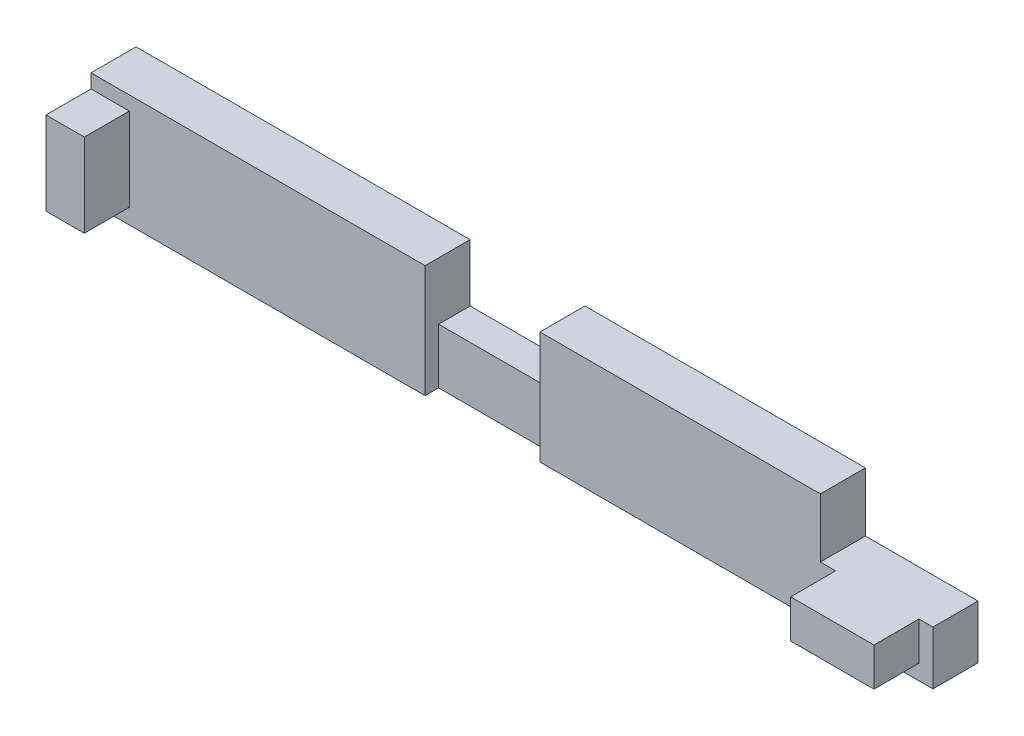
ISO-10303-21;
HEADER;
FILE_DESCRIPTION(('STEP AP214'),'2;1');
FILE_NAME('part.step','',(''),(''),'','','');
FILE_SCHEMA(('AUTOMOTIVE_DESIGN { 1 0 10303 214 1 1 1 1 }'));
ENDSEC;
DATA;
#1=APPLICATION_CONTEXT('core data for automotive mechanical design processes');
#2=APPLICATION_PROTOCOL_DEFINITION('international standard','automotive_design',2000,#1);
#3=PRODUCT_CONTEXT('',#1,'mechanical');
#4=PRODUCT('Part','Part','',(#3));
#5=PRODUCT_RELATED_PRODUCT_CATEGORY('part','',(#4));
#6=PRODUCT_DEFINITION_FORMATION('','',#4);
#7=PRODUCT_DEFINITION_CONTEXT('part definition',#1,'design');
#8=PRODUCT_DEFINITION('design','',#6,#7);
#9=PRODUCT_DEFINITION_SHAPE('','',#8);
#10=(LENGTH_UNIT() NAMED_UNIT(*) SI_UNIT(.MILLI.,.METRE.));
#11=(NAMED_UNIT(*) PLANE_ANGLE_UNIT() SI_UNIT($,.RADIAN.));
#12=(NAMED_UNIT(*) SI_UNIT($,.STERADIAN.) SOLID_ANGLE_UNIT());
#13=UNCERTAINTY_MEASURE_WITH_UNIT(LENGTH_MEASURE(1.E-05),#10,'distance_accuracy_value','');
#14=(GEOMETRIC_REPRESENTATION_CONTEXT(3) GLOBAL_UNCERTAINTY_ASSIGNED_CONTEXT((#13)) GLOBAL_UNIT_ASSIGNED_CONTEXT((#10,
#11,#12)) REPRESENTATION_CONTEXT('',''));
#15=CARTESIAN_POINT('',(0.,0.,0.));
#16=DIRECTION('',(0.,0.,1.));
#17=DIRECTION('',(1.,0.,0.));
#18=AXIS2_PLACEMENT_3D('',#15,#16,#17);
#19=CARTESIAN_POINT('',(0.,0.,10.));
#20=DIRECTION('',(0.,0.,-1.));
#21=DIRECTION('',(-1.,0.,0.));
#22=AXIS2_PLACEMENT_3D('',#19,#20,#21);
#23=PLANE('',#22);
#24=DIRECTION('',(1.,0.,0.));
#25=VECTOR('',#24,1.);
#26=CARTESIAN_POINT('',(0.,0.,10.));
#27=LINE('',#26,#25);
#28=CARTESIAN_POINT('',(13.1,0.,10.));
#29=VERTEX_POINT('',#28);
#30=CARTESIAN_POINT('',(87.25,0.,10.));
#31=VERTEX_POINT('',#30);
#32=EDGE_CURVE('E213',#29,#31,#27,.T.);
#33=ORIENTED_EDGE('',*,*,#32,.T.);
#34=DIRECTION('',(0.,-1.,0.));
#35=VECTOR('',#34,1.);
#36=CARTESIAN_POINT('',(87.25,37.75,10.));
#37=LINE('',#36,#35);
#38=CARTESIAN_POINT('',(87.25,25.,10.));
#39=VERTEX_POINT('',#38);
#40=EDGE_CURVE('E207',#39,#31,#37,.T.);
#41=ORIENTED_EDGE('',*,*,#40,.F.);
#42=DIRECTION('',(-1.,0.,0.));
#43=VECTOR('',#42,1.);
#44=CARTESIAN_POINT('',(0.,25.,10.));
#45=LINE('',#44,#43);
#46=CARTESIAN_POINT('',(13.1,25.,10.));
#47=VERTEX_POINT('',#46);
#48=EDGE_CURVE('E220',#39,#47,#45,.T.);
#49=ORIENTED_EDGE('',*,*,#48,.T.);
#50=DIRECTION('',(0.,-1.,0.));
#51=VECTOR('',#50,1.);
#52=CARTESIAN_POINT('',(13.1,0.,10.));
#53=LINE('',#52,#51);
#54=CARTESIAN_POINT('',(13.1,21.9,10.));
#55=VERTEX_POINT('',#54);
#56=EDGE_CURVE('E338',#47,#55,#53,.T.);
#57=ORIENTED_EDGE('',*,*,#56,.T.);
#58=DIRECTION('',(1.,0.,0.));
#59=VECTOR('',#58,1.);
#60=CARTESIAN_POINT('',(0.,21.9,10.));
#61=LINE('',#60,#59);
#62=CARTESIAN_POINT('',(21.6,21.9,10.));
#63=VERTEX_POINT('',#62);
#64=EDGE_CURVE('E279',#55,#63,#61,.T.);
#65=ORIENTED_EDGE('',*,*,#64,.T.);
#66=DIRECTION('',(0.,-1.,0.));
#67=VECTOR('',#66,1.);
#68=CARTESIAN_POINT('',(21.6,0.,10.));
#69=LINE('',#68,#67);
#70=CARTESIAN_POINT('',(21.6,3.40000000000001,10.));
#71=VERTEX_POINT('',#70);
#72=EDGE_CURVE('E271',#63,#71,#69,.T.);
#73=ORIENTED_EDGE('',*,*,#72,.T.);
#74=DIRECTION('',(1.,0.,0.));
#75=VECTOR('',#74,1.);
#76=CARTESIAN_POINT('',(0.,3.40000000000001,10.));
#77=LINE('',#76,#75);
#78=CARTESIAN_POINT('',(13.1,3.40000000000001,10.));
#79=VERTEX_POINT('',#78);
#80=EDGE_CURVE('E50',#79,#71,#77,.T.);
#81=ORIENTED_EDGE('',*,*,#80,.F.);
#82=EDGE_CURVE('E265',#79,#29,#53,.T.);
#83=ORIENTED_EDGE('',*,*,#82,.T.);
#84=EDGE_LOOP('',(#33,#41,#49,#57,#65,#73,#81,#83));
#85=FACE_BOUND('',#84,.T.);
#86=ADVANCED_FACE('F35',(#85),#23,.F.);
#87=CARTESIAN_POINT('',(0.,0.,10.));
#88=DIRECTION('',(0.,1.,0.));
#89=DIRECTION('',(0.,0.,1.));
#90=AXIS2_PLACEMENT_3D('',#87,#88,#89);
#91=PLANE('',#90);
#92=DIRECTION('',(-1.,0.,0.));
#93=VECTOR('',#92,1.);
#94=CARTESIAN_POINT('',(0.,0.,7.));
#95=LINE('',#94,#93);
#96=CARTESIAN_POINT('',(112.75,0.,7.));
#97=VERTEX_POINT('',#96);
#98=CARTESIAN_POINT('',(87.25,0.,7.));
#99=VERTEX_POINT('',#98);
#100=EDGE_CURVE('E180',#97,#99,#95,.T.);
#101=ORIENTED_EDGE('',*,*,#100,.T.);
#102=DIRECTION('',(0.,0.,1.));
#103=VECTOR('',#102,1.);
#104=CARTESIAN_POINT('',(87.25,0.,10.));
#105=LINE('',#104,#103);
#106=EDGE_CURVE('E261',#99,#31,#105,.T.);
#107=ORIENTED_EDGE('',*,*,#106,.T.);
#108=ORIENTED_EDGE('',*,*,#32,.F.);
#109=DIRECTION('',(0.,0.,1.));
#110=VECTOR('',#109,1.);
#111=CARTESIAN_POINT('',(13.1,0.,0.));
#112=LINE('',#111,#110);
#113=CARTESIAN_POINT('',(13.1,0.,0.));
#114=VERTEX_POINT('',#113);
#115=EDGE_CURVE('E282',#114,#29,#112,.T.);
#116=ORIENTED_EDGE('',*,*,#115,.F.);
#117=DIRECTION('',(1.,0.,0.));
#118=VECTOR('',#117,1.);
#119=CARTESIAN_POINT('',(0.,0.,0.));
#120=LINE('',#119,#118);
#121=CARTESIAN_POINT('',(200.,0.,0.));
#122=VERTEX_POINT('',#121);
#123=EDGE_CURVE('E212',#114,#122,#120,.T.);
#124=ORIENTED_EDGE('',*,*,#123,.T.);
#125=DIRECTION('',(0.,0.,-1.));
#126=VECTOR('',#125,1.);
#127=CARTESIAN_POINT('',(200.,0.,10.));
#128=LINE('',#127,#126);
#129=CARTESIAN_POINT('',(200.,0.,10.));
#130=VERTEX_POINT('',#129);
#131=EDGE_CURVE('E43',#130,#122,#128,.T.);
#132=ORIENTED_EDGE('',*,*,#131,.F.);
#133=CARTESIAN_POINT('',(112.75,0.,10.));
#134=VERTEX_POINT('',#133);
#135=EDGE_CURVE('E217',#134,#130,#27,.T.);
#136=ORIENTED_EDGE('',*,*,#135,.F.);
#137=DIRECTION('',(0.,0.,-1.));
#138=VECTOR('',#137,1.);
#139=CARTESIAN_POINT('',(112.75,0.,10.));
#140=LINE('',#139,#138);
#141=EDGE_CURVE('E392',#134,#97,#140,.T.);
#142=ORIENTED_EDGE('',*,*,#141,.T.);
#143=EDGE_LOOP('',(#101,#107,#108,#116,#124,#132,#136,#142));
#144=FACE_BOUND('',#143,.T.);
#145=ADVANCED_FACE('F37',(#144),#91,.F.);
#146=CARTESIAN_POINT('',(200.,0.,10.));
#147=DIRECTION('',(-1.,0.,0.));
#148=DIRECTION('',(0.,0.,1.));
#149=AXIS2_PLACEMENT_3D('',#146,#147,#148);
#150=PLANE('',#149);
#151=DIRECTION('',(0.,0.,1.));
#152=VECTOR('',#151,1.);
#153=CARTESIAN_POINT('',(200.,11.9,0.));
#154=LINE('',#153,#152);
#155=CARTESIAN_POINT('',(200.,11.9,0.));
#156=VERTEX_POINT('',#155);
#157=CARTESIAN_POINT('',(200.,11.9,10.));
#158=VERTEX_POINT('',#157);
#159=EDGE_CURVE('E263',#156,#158,#154,.T.);
#160=ORIENTED_EDGE('',*,*,#159,.T.);
#161=DIRECTION('',(0.,1.,0.));
#162=VECTOR('',#161,1.);
#163=CARTESIAN_POINT('',(200.,0.,10.));
#164=LINE('',#163,#162);
#165=EDGE_CURVE('E216',#130,#158,#164,.T.);
#166=ORIENTED_EDGE('',*,*,#165,.F.);
#167=ORIENTED_EDGE('',*,*,#131,.T.);
#168=DIRECTION('',(0.,1.,0.));
#169=VECTOR('',#168,1.);
#170=CARTESIAN_POINT('',(200.,0.,0.));
#171=LINE('',#170,#169);
#172=EDGE_CURVE('E224',#122,#156,#171,.T.);
#173=ORIENTED_EDGE('',*,*,#172,.T.);
#174=EDGE_LOOP('',(#160,#166,#167,#173));
#175=FACE_BOUND('',#174,.T.);
#176=ADVANCED_FACE('F235',(#175),#150,.F.);
#177=CARTESIAN_POINT('',(0.,25.,10.));
#178=DIRECTION('',(0.,-1.,0.));
#179=DIRECTION('',(0.,0.,-1.));
#180=AXIS2_PLACEMENT_3D('',#177,#178,#179);
#181=PLANE('',#180);
#182=DIRECTION('',(0.,0.,1.));
#183=VECTOR('',#182,1.);
#184=CARTESIAN_POINT('',(13.1,25.,0.));
#185=LINE('',#184,#183);
#186=CARTESIAN_POINT('',(13.1,25.,0.));
#187=VERTEX_POINT('',#186);
#188=EDGE_CURVE('E343',#187,#47,#185,.T.);
#189=ORIENTED_EDGE('',*,*,#188,.T.);
#190=ORIENTED_EDGE('',*,*,#48,.F.);
#191=DIRECTION('',(0.,0.,-1.));
#192=VECTOR('',#191,1.);
#193=CARTESIAN_POINT('',(87.25,25.,10.));
#194=LINE('',#193,#192);
#195=CARTESIAN_POINT('',(87.25,25.,0.));
#196=VERTEX_POINT('',#195);
#197=EDGE_CURVE('E199',#39,#196,#194,.T.);
#198=ORIENTED_EDGE('',*,*,#197,.T.);
#199=DIRECTION('',(-1.,0.,0.));
#200=VECTOR('',#199,1.);
#201=CARTESIAN_POINT('',(0.,25.,0.));
#202=LINE('',#201,#200);
#203=EDGE_CURVE('E227',#196,#187,#202,.T.);
#204=ORIENTED_EDGE('',*,*,#203,.T.);
#205=EDGE_LOOP('',(#189,#190,#198,#204));
#206=FACE_BOUND('',#205,.T.);
#207=ADVANCED_FACE('F350',(#206),#181,.F.);
#208=DIRECTION('',(0.,1.,0.));
#209=VECTOR('',#208,1.);
#210=CARTESIAN_POINT('',(112.75,37.75,10.));
#211=LINE('',#210,#209);
#212=CARTESIAN_POINT('',(112.75,25.,10.));
#213=VERTEX_POINT('',#212);
#214=EDGE_CURVE('E322',#134,#213,#211,.T.);
#215=ORIENTED_EDGE('',*,*,#214,.F.);
#216=ORIENTED_EDGE('',*,*,#135,.T.);
#217=ORIENTED_EDGE('',*,*,#165,.T.);
#218=DIRECTION('',(-1.,0.,0.));
#219=VECTOR('',#218,1.);
#220=CARTESIAN_POINT('',(0.,11.9,10.));
#221=LINE('',#220,#219);
#222=CARTESIAN_POINT('',(196.9,11.9,10.));
#223=VERTEX_POINT('',#222);
#224=EDGE_CURVE('E253',#158,#223,#221,.T.);
#225=ORIENTED_EDGE('',*,*,#224,.T.);
#226=DIRECTION('',(0.,-1.,0.));
#227=VECTOR('',#226,1.);
#228=CARTESIAN_POINT('',(196.9,0.,10.));
#229=LINE('',#228,#227);
#230=CARTESIAN_POINT('',(196.9,3.4,10.));
#231=VERTEX_POINT('',#230);
#232=EDGE_CURVE('E299',#223,#231,#229,.T.);
#233=ORIENTED_EDGE('',*,*,#232,.T.);
#234=DIRECTION('',(-1.,0.,0.));
#235=VECTOR('',#234,1.);
#236=CARTESIAN_POINT('',(0.,3.39999999999997,10.));
#237=LINE('',#236,#235);
#238=CARTESIAN_POINT('',(178.4,3.4,10.));
#239=VERTEX_POINT('',#238);
#240=EDGE_CURVE('E58',#231,#239,#237,.T.);
#241=ORIENTED_EDGE('',*,*,#240,.T.);
#242=DIRECTION('',(0.,-1.,0.));
#243=VECTOR('',#242,1.);
#244=CARTESIAN_POINT('',(178.4,0.,10.));
#245=LINE('',#244,#243);
#246=CARTESIAN_POINT('',(178.4,11.9,10.));
#247=VERTEX_POINT('',#246);
#248=EDGE_CURVE('E294',#247,#239,#245,.T.);
#249=ORIENTED_EDGE('',*,*,#248,.F.);
#250=CARTESIAN_POINT('',(175.,11.9,10.));
#251=VERTEX_POINT('',#250);
#252=EDGE_CURVE('E260',#247,#251,#221,.T.);
#253=ORIENTED_EDGE('',*,*,#252,.T.);
#254=DIRECTION('',(0.,-1.,0.));
#255=VECTOR('',#254,1.);
#256=CARTESIAN_POINT('',(175.,0.,10.));
#257=LINE('',#256,#255);
#258=CARTESIAN_POINT('',(175.,25.,10.));
#259=VERTEX_POINT('',#258);
#260=EDGE_CURVE('E257',#259,#251,#257,.T.);
#261=ORIENTED_EDGE('',*,*,#260,.F.);
#262=EDGE_CURVE('E221',#259,#213,#45,.T.);
#263=ORIENTED_EDGE('',*,*,#262,.T.);
#264=EDGE_LOOP('',(#215,#216,#217,#225,#233,#241,#249,#253,#261,#263));
#265=FACE_BOUND('',#264,.T.);
#266=ADVANCED_FACE('F376',(#265),#23,.F.);
#267=CARTESIAN_POINT('',(0.,0.,0.));
#268=DIRECTION('',(0.,0.,-1.));
#269=DIRECTION('',(-1.,0.,0.));
#270=AXIS2_PLACEMENT_3D('',#267,#268,#269);
#271=PLANE('',#270);
#272=ORIENTED_EDGE('',*,*,#123,.F.);
#273=DIRECTION('',(0.,-1.,0.));
#274=VECTOR('',#273,1.);
#275=CARTESIAN_POINT('',(13.1,0.,0.));
#276=LINE('',#275,#274);
#277=EDGE_CURVE('E340',#187,#114,#276,.T.);
#278=ORIENTED_EDGE('',*,*,#277,.F.);
#279=ORIENTED_EDGE('',*,*,#203,.F.);
#280=DIRECTION('',(0.,1.,0.));
#281=VECTOR('',#280,1.);
#282=CARTESIAN_POINT('',(87.25,0.,0.));
#283=LINE('',#282,#281);
#284=CARTESIAN_POINT('',(87.25,12.25,0.));
#285=VERTEX_POINT('',#284);
#286=EDGE_CURVE('E11',#285,#196,#283,.T.);
#287=ORIENTED_EDGE('',*,*,#286,.F.);
#288=DIRECTION('',(1.,0.,0.));
#289=VECTOR('',#288,1.);
#290=CARTESIAN_POINT('',(87.25,12.25,0.));
#291=LINE('',#290,#289);
#292=CARTESIAN_POINT('',(112.75,12.25,0.));
#293=VERTEX_POINT('',#292);
#294=EDGE_CURVE('E204',#285,#293,#291,.T.);
#295=ORIENTED_EDGE('',*,*,#294,.T.);
#296=DIRECTION('',(0.,1.,0.));
#297=VECTOR('',#296,1.);
#298=CARTESIAN_POINT('',(112.75,37.75,0.));
#299=LINE('',#298,#297);
#300=CARTESIAN_POINT('',(112.75,25.,0.));
#301=VERTEX_POINT('',#300);
#302=EDGE_CURVE('E197',#293,#301,#299,.T.);
#303=ORIENTED_EDGE('',*,*,#302,.T.);
#304=CARTESIAN_POINT('',(175.,25.,0.));
#305=VERTEX_POINT('',#304);
#306=EDGE_CURVE('E228',#305,#301,#202,.T.);
#307=ORIENTED_EDGE('',*,*,#306,.F.);
#308=DIRECTION('',(0.,-1.,0.));
#309=VECTOR('',#308,1.);
#310=CARTESIAN_POINT('',(175.,0.,0.));
#311=LINE('',#310,#309);
#312=CARTESIAN_POINT('',(175.,11.9,0.));
#313=VERTEX_POINT('',#312);
#314=EDGE_CURVE('E246',#305,#313,#311,.T.);
#315=ORIENTED_EDGE('',*,*,#314,.T.);
#316=DIRECTION('',(-1.,0.,0.));
#317=VECTOR('',#316,1.);
#318=CARTESIAN_POINT('',(0.,11.9,0.));
#319=LINE('',#318,#317);
#320=EDGE_CURVE('E244',#156,#313,#319,.T.);
#321=ORIENTED_EDGE('',*,*,#320,.F.);
#322=ORIENTED_EDGE('',*,*,#172,.F.);
#323=EDGE_LOOP('',(#272,#278,#279,#287,#295,#303,#307,#315,#321,#322));
#324=FACE_BOUND('',#323,.T.);
#325=ADVANCED_FACE('F241',(#324),#271,.T.);
#326=ORIENTED_EDGE('',*,*,#262,.F.);
#327=DIRECTION('',(0.,0.,1.));
#328=VECTOR('',#327,1.);
#329=CARTESIAN_POINT('',(175.,25.,0.));
#330=LINE('',#329,#328);
#331=EDGE_CURVE('E249',#305,#259,#330,.T.);
#332=ORIENTED_EDGE('',*,*,#331,.F.);
#333=ORIENTED_EDGE('',*,*,#306,.T.);
#334=DIRECTION('',(0.,0.,1.));
#335=VECTOR('',#334,1.);
#336=CARTESIAN_POINT('',(112.75,25.,10.));
#337=LINE('',#336,#335);
#338=EDGE_CURVE('E202',#301,#213,#337,.T.);
#339=ORIENTED_EDGE('',*,*,#338,.T.);
#340=EDGE_LOOP('',(#326,#332,#333,#339));
#341=FACE_BOUND('',#340,.T.);
#342=ADVANCED_FACE('F388',(#341),#181,.F.);
#343=CARTESIAN_POINT('',(112.75,37.75,0.));
#344=DIRECTION('',(1.,0.,0.));
#345=DIRECTION('',(0.,0.,-1.));
#346=AXIS2_PLACEMENT_3D('',#343,#344,#345);
#347=PLANE('',#346);
#348=ORIENTED_EDGE('',*,*,#302,.F.);
#349=DIRECTION('',(0.,0.,1.));
#350=VECTOR('',#349,1.);
#351=CARTESIAN_POINT('',(112.75,12.25,0.));
#352=LINE('',#351,#350);
#353=CARTESIAN_POINT('',(112.75,12.25,7.));
#354=VERTEX_POINT('',#353);
#355=EDGE_CURVE('E189',#293,#354,#352,.T.);
#356=ORIENTED_EDGE('',*,*,#355,.T.);
#357=DIRECTION('',(0.,1.,0.));
#358=VECTOR('',#357,1.);
#359=CARTESIAN_POINT('',(112.75,-0.750000000000001,7.));
#360=LINE('',#359,#358);
#361=EDGE_CURVE('E173',#97,#354,#360,.T.);
#362=ORIENTED_EDGE('',*,*,#361,.F.);
#363=ORIENTED_EDGE('',*,*,#141,.F.);
#364=ORIENTED_EDGE('',*,*,#214,.T.);
#365=ORIENTED_EDGE('',*,*,#338,.F.);
#366=EDGE_LOOP('',(#348,#356,#362,#363,#364,#365));
#367=FACE_BOUND('',#366,.T.);
#368=ADVANCED_FACE('F194',(#367),#347,.F.);
#369=CARTESIAN_POINT('',(87.25,37.75,0.));
#370=DIRECTION('',(-1.,0.,0.));
#371=DIRECTION('',(0.,-1.,0.));
#372=AXIS2_PLACEMENT_3D('',#369,#370,#371);
#373=PLANE('',#372);
#374=ORIENTED_EDGE('',*,*,#40,.T.);
#375=ORIENTED_EDGE('',*,*,#106,.F.);
#376=DIRECTION('',(0.,1.,0.));
#377=VECTOR('',#376,1.);
#378=CARTESIAN_POINT('',(87.25,-0.750000000000001,7.));
#379=LINE('',#378,#377);
#380=CARTESIAN_POINT('',(87.25,12.25,7.));
#381=VERTEX_POINT('',#380);
#382=EDGE_CURVE('E185',#99,#381,#379,.T.);
#383=ORIENTED_EDGE('',*,*,#382,.T.);
#384=DIRECTION('',(0.,0.,1.));
#385=VECTOR('',#384,1.);
#386=CARTESIAN_POINT('',(87.25,12.25,0.));
#387=LINE('',#386,#385);
#388=EDGE_CURVE('E192',#285,#381,#387,.T.);
#389=ORIENTED_EDGE('',*,*,#388,.F.);
#390=ORIENTED_EDGE('',*,*,#286,.T.);
#391=ORIENTED_EDGE('',*,*,#197,.F.);
#392=EDGE_LOOP('',(#374,#375,#383,#389,#390,#391));
#393=FACE_BOUND('',#392,.T.);
#394=ADVANCED_FACE('F328',(#393),#373,.F.);
#395=CARTESIAN_POINT('',(87.25,12.25,0.));
#396=DIRECTION('',(0.,-1.,0.));
#397=DIRECTION('',(0.,0.,-1.));
#398=AXIS2_PLACEMENT_3D('',#395,#396,#397);
#399=PLANE('',#398);
#400=ORIENTED_EDGE('',*,*,#388,.T.);
#401=DIRECTION('',(-1.,0.,0.));
#402=VECTOR('',#401,1.);
#403=CARTESIAN_POINT('',(87.25,12.25,7.));
#404=LINE('',#403,#402);
#405=EDGE_CURVE('E177',#354,#381,#404,.T.);
#406=ORIENTED_EDGE('',*,*,#405,.F.);
#407=ORIENTED_EDGE('',*,*,#355,.F.);
#408=ORIENTED_EDGE('',*,*,#294,.F.);
#409=EDGE_LOOP('',(#400,#406,#407,#408));
#410=FACE_BOUND('',#409,.T.);
#411=ADVANCED_FACE('F188',(#410),#399,.F.);
#412=CARTESIAN_POINT('',(0.,11.9,20.));
#413=DIRECTION('',(0.,1.,0.));
#414=DIRECTION('',(0.,0.,1.));
#415=AXIS2_PLACEMENT_3D('',#412,#413,#414);
#416=PLANE('',#415);
#417=DIRECTION('',(0.,0.,-1.));
#418=VECTOR('',#417,1.);
#419=CARTESIAN_POINT('',(196.9,11.9,20.));
#420=LINE('',#419,#418);
#421=CARTESIAN_POINT('',(196.9,11.9,20.));
#422=VERTEX_POINT('',#421);
#423=EDGE_CURVE('E307',#422,#223,#420,.T.);
#424=ORIENTED_EDGE('',*,*,#423,.T.);
#425=ORIENTED_EDGE('',*,*,#224,.F.);
#426=ORIENTED_EDGE('',*,*,#159,.F.);
#427=ORIENTED_EDGE('',*,*,#320,.T.);
#428=DIRECTION('',(0.,0.,1.));
#429=VECTOR('',#428,1.);
#430=CARTESIAN_POINT('',(175.,11.9,0.));
#431=LINE('',#430,#429);
#432=EDGE_CURVE('E251',#313,#251,#431,.T.);
#433=ORIENTED_EDGE('',*,*,#432,.T.);
#434=ORIENTED_EDGE('',*,*,#252,.F.);
#435=DIRECTION('',(0.,0.,-1.));
#436=VECTOR('',#435,1.);
#437=CARTESIAN_POINT('',(178.4,11.9,20.));
#438=LINE('',#437,#436);
#439=CARTESIAN_POINT('',(178.4,11.9,20.));
#440=VERTEX_POINT('',#439);
#441=EDGE_CURVE('E319',#440,#247,#438,.T.);
#442=ORIENTED_EDGE('',*,*,#441,.F.);
#443=DIRECTION('',(1.,0.,0.));
#444=VECTOR('',#443,1.);
#445=CARTESIAN_POINT('',(0.,11.9,20.));
#446=LINE('',#445,#444);
#447=EDGE_CURVE('E295',#440,#422,#446,.T.);
#448=ORIENTED_EDGE('',*,*,#447,.T.);
#449=EDGE_LOOP('',(#424,#425,#426,#427,#433,#434,#442,#448));
#450=FACE_BOUND('',#449,.T.);
#451=ADVANCED_FACE('F400',(#450),#416,.T.);
#452=CARTESIAN_POINT('',(178.4,0.,20.));
#453=DIRECTION('',(1.,0.,0.));
#454=DIRECTION('',(0.,0.,-1.));
#455=AXIS2_PLACEMENT_3D('',#452,#453,#454);
#456=PLANE('',#455);
#457=ORIENTED_EDGE('',*,*,#248,.T.);
#458=DIRECTION('',(0.,0.,-1.));
#459=VECTOR('',#458,1.);
#460=CARTESIAN_POINT('',(178.4,3.4,20.));
#461=LINE('',#460,#459);
#462=CARTESIAN_POINT('',(178.4,3.4,20.));
#463=VERTEX_POINT('',#462);
#464=EDGE_CURVE('E317',#463,#239,#461,.T.);
#465=ORIENTED_EDGE('',*,*,#464,.F.);
#466=DIRECTION('',(0.,-1.,0.));
#467=VECTOR('',#466,1.);
#468=CARTESIAN_POINT('',(178.4,0.,20.));
#469=LINE('',#468,#467);
#470=EDGE_CURVE('E298',#440,#463,#469,.T.);
#471=ORIENTED_EDGE('',*,*,#470,.F.);
#472=ORIENTED_EDGE('',*,*,#441,.T.);
#473=EDGE_LOOP('',(#457,#465,#471,#472));
#474=FACE_BOUND('',#473,.T.);
#475=ADVANCED_FACE('F403',(#474),#456,.F.);
#476=CARTESIAN_POINT('',(0.,3.39999999999997,20.));
#477=DIRECTION('',(0.,-1.,0.));
#478=DIRECTION('',(1.,0.,0.));
#479=AXIS2_PLACEMENT_3D('',#476,#477,#478);
#480=PLANE('',#479);
#481=ORIENTED_EDGE('',*,*,#240,.F.);
#482=DIRECTION('',(0.,0.,-1.));
#483=VECTOR('',#482,1.);
#484=CARTESIAN_POINT('',(196.9,3.4,20.));
#485=LINE('',#484,#483);
#486=CARTESIAN_POINT('',(196.9,3.4,20.));
#487=VERTEX_POINT('',#486);
#488=EDGE_CURVE('E315',#487,#231,#485,.T.);
#489=ORIENTED_EDGE('',*,*,#488,.F.);
#490=DIRECTION('',(-1.,0.,0.));
#491=VECTOR('',#490,1.);
#492=CARTESIAN_POINT('',(0.,3.39999999999997,20.));
#493=LINE('',#492,#491);
#494=EDGE_CURVE('E301',#487,#463,#493,.T.);
#495=ORIENTED_EDGE('',*,*,#494,.T.);
#496=ORIENTED_EDGE('',*,*,#464,.T.);
#497=EDGE_LOOP('',(#481,#489,#495,#496));
#498=FACE_BOUND('',#497,.T.);
#499=ADVANCED_FACE('F413',(#498),#480,.T.);
#500=CARTESIAN_POINT('',(196.9,0.,20.));
#501=DIRECTION('',(1.,0.,0.));
#502=DIRECTION('',(0.,0.,-1.));
#503=AXIS2_PLACEMENT_3D('',#500,#501,#502);
#504=PLANE('',#503);
#505=ORIENTED_EDGE('',*,*,#232,.F.);
#506=ORIENTED_EDGE('',*,*,#423,.F.);
#507=DIRECTION('',(0.,-1.,0.));
#508=VECTOR('',#507,1.);
#509=CARTESIAN_POINT('',(196.9,0.,20.));
#510=LINE('',#509,#508);
#511=EDGE_CURVE('E304',#422,#487,#510,.T.);
#512=ORIENTED_EDGE('',*,*,#511,.T.);
#513=ORIENTED_EDGE('',*,*,#488,.T.);
#514=EDGE_LOOP('',(#505,#506,#512,#513));
#515=FACE_BOUND('',#514,.T.);
#516=ADVANCED_FACE('F412',(#515),#504,.T.);
#517=CARTESIAN_POINT('',(0.,0.,20.));
#518=DIRECTION('',(0.,0.,1.));
#519=DIRECTION('',(1.,0.,0.));
#520=AXIS2_PLACEMENT_3D('',#517,#518,#519);
#521=PLANE('',#520);
#522=ORIENTED_EDGE('',*,*,#447,.F.);
#523=ORIENTED_EDGE('',*,*,#470,.T.);
#524=ORIENTED_EDGE('',*,*,#494,.F.);
#525=ORIENTED_EDGE('',*,*,#511,.F.);
#526=EDGE_LOOP('',(#522,#523,#524,#525));
#527=FACE_BOUND('',#526,.T.);
#528=ADVANCED_FACE('F409',(#527),#521,.T.);
#529=CARTESIAN_POINT('',(0.,21.9,20.));
#530=DIRECTION('',(0.,1.,0.));
#531=DIRECTION('',(-1.,0.,0.));
#532=AXIS2_PLACEMENT_3D('',#529,#530,#531);
#533=PLANE('',#532);
#534=ORIENTED_EDGE('',*,*,#64,.F.);
#535=DIRECTION('',(0.,0.,-1.));
#536=VECTOR('',#535,1.);
#537=CARTESIAN_POINT('',(13.1,21.9,20.));
#538=LINE('',#537,#536);
#539=CARTESIAN_POINT('',(13.1,21.9,20.));
#540=VERTEX_POINT('',#539);
#541=EDGE_CURVE('E291',#540,#55,#538,.T.);
#542=ORIENTED_EDGE('',*,*,#541,.F.);
#543=DIRECTION('',(1.,0.,0.));
#544=VECTOR('',#543,1.);
#545=CARTESIAN_POINT('',(0.,21.9,20.));
#546=LINE('',#545,#544);
#547=CARTESIAN_POINT('',(21.6,21.9,20.));
#548=VERTEX_POINT('',#547);
#549=EDGE_CURVE('E267',#540,#548,#546,.T.);
#550=ORIENTED_EDGE('',*,*,#549,.T.);
#551=DIRECTION('',(0.,0.,-1.));
#552=VECTOR('',#551,1.);
#553=CARTESIAN_POINT('',(21.6,21.9,20.));
#554=LINE('',#553,#552);
#555=EDGE_CURVE('E278',#548,#63,#554,.T.);
#556=ORIENTED_EDGE('',*,*,#555,.T.);
#557=EDGE_LOOP('',(#534,#542,#550,#556));
#558=FACE_BOUND('',#557,.T.);
#559=ADVANCED_FACE('F355',(#558),#533,.T.);
#560=CARTESIAN_POINT('',(13.1,0.,20.));
#561=DIRECTION('',(1.,0.,0.));
#562=DIRECTION('',(0.,1.,0.));
#563=AXIS2_PLACEMENT_3D('',#560,#561,#562);
#564=PLANE('',#563);
#565=ORIENTED_EDGE('',*,*,#541,.T.);
#566=ORIENTED_EDGE('',*,*,#56,.F.);
#567=ORIENTED_EDGE('',*,*,#188,.F.);
#568=ORIENTED_EDGE('',*,*,#277,.T.);
#569=ORIENTED_EDGE('',*,*,#115,.T.);
#570=ORIENTED_EDGE('',*,*,#82,.F.);
#571=DIRECTION('',(0.,0.,-1.));
#572=VECTOR('',#571,1.);
#573=CARTESIAN_POINT('',(13.1,3.40000000000001,20.));
#574=LINE('',#573,#572);
#575=CARTESIAN_POINT('',(13.1,3.40000000000001,20.));
#576=VERTEX_POINT('',#575);
#577=EDGE_CURVE('E289',#576,#79,#574,.T.);
#578=ORIENTED_EDGE('',*,*,#577,.F.);
#579=DIRECTION('',(0.,-1.,0.));
#580=VECTOR('',#579,1.);
#581=CARTESIAN_POINT('',(13.1,0.,20.));
#582=LINE('',#581,#580);
#583=EDGE_CURVE('E270',#540,#576,#582,.T.);
#584=ORIENTED_EDGE('',*,*,#583,.F.);
#585=EDGE_LOOP('',(#565,#566,#567,#568,#569,#570,#578,#584));
#586=FACE_BOUND('',#585,.T.);
#587=ADVANCED_FACE('F347',(#586),#564,.F.);
#588=CARTESIAN_POINT('',(0.,3.40000000000001,20.));
#589=DIRECTION('',(0.,1.,0.));
#590=DIRECTION('',(0.,0.,1.));
#591=AXIS2_PLACEMENT_3D('',#588,#589,#590);
#592=PLANE('',#591);
#593=ORIENTED_EDGE('',*,*,#80,.T.);
#594=DIRECTION('',(0.,0.,-1.));
#595=VECTOR('',#594,1.);
#596=CARTESIAN_POINT('',(21.6,3.40000000000001,20.));
#597=LINE('',#596,#595);
#598=CARTESIAN_POINT('',(21.6,3.40000000000001,20.));
#599=VERTEX_POINT('',#598);
#600=EDGE_CURVE('E287',#599,#71,#597,.T.);
#601=ORIENTED_EDGE('',*,*,#600,.F.);
#602=DIRECTION('',(1.,0.,0.));
#603=VECTOR('',#602,1.);
#604=CARTESIAN_POINT('',(0.,3.40000000000001,20.));
#605=LINE('',#604,#603);
#606=EDGE_CURVE('E273',#576,#599,#605,.T.);
#607=ORIENTED_EDGE('',*,*,#606,.F.);
#608=ORIENTED_EDGE('',*,*,#577,.T.);
#609=EDGE_LOOP('',(#593,#601,#607,#608));
#610=FACE_BOUND('',#609,.T.);
#611=ADVANCED_FACE('F361',(#610),#592,.F.);
#612=CARTESIAN_POINT('',(21.6,0.,20.));
#613=DIRECTION('',(1.,0.,0.));
#614=DIRECTION('',(0.,0.,-1.));
#615=AXIS2_PLACEMENT_3D('',#612,#613,#614);
#616=PLANE('',#615);
#617=ORIENTED_EDGE('',*,*,#72,.F.);
#618=ORIENTED_EDGE('',*,*,#555,.F.);
#619=DIRECTION('',(0.,-1.,0.));
#620=VECTOR('',#619,1.);
#621=CARTESIAN_POINT('',(21.6,0.,20.));
#622=LINE('',#621,#620);
#623=EDGE_CURVE('E275',#548,#599,#622,.T.);
#624=ORIENTED_EDGE('',*,*,#623,.T.);
#625=ORIENTED_EDGE('',*,*,#600,.T.);
#626=EDGE_LOOP('',(#617,#618,#624,#625));
#627=FACE_BOUND('',#626,.T.);
#628=ADVANCED_FACE('F359',(#627),#616,.T.);
#629=CARTESIAN_POINT('',(0.,0.,20.));
#630=DIRECTION('',(0.,0.,1.));
#631=DIRECTION('',(1.,0.,0.));
#632=AXIS2_PLACEMENT_3D('',#629,#630,#631);
#633=PLANE('',#632);
#634=ORIENTED_EDGE('',*,*,#549,.F.);
#635=ORIENTED_EDGE('',*,*,#583,.T.);
#636=ORIENTED_EDGE('',*,*,#606,.T.);
#637=ORIENTED_EDGE('',*,*,#623,.F.);
#638=EDGE_LOOP('',(#634,#635,#636,#637));
#639=FACE_BOUND('',#638,.T.);
#640=ADVANCED_FACE('F363',(#639),#633,.T.);
#641=CARTESIAN_POINT('',(175.,0.,0.));
#642=DIRECTION('',(-1.,0.,0.));
#643=DIRECTION('',(0.,0.,1.));
#644=AXIS2_PLACEMENT_3D('',#641,#642,#643);
#645=PLANE('',#644);
#646=ORIENTED_EDGE('',*,*,#260,.T.);
#647=ORIENTED_EDGE('',*,*,#432,.F.);
#648=ORIENTED_EDGE('',*,*,#314,.F.);
#649=ORIENTED_EDGE('',*,*,#331,.T.);
#650=EDGE_LOOP('',(#646,#647,#648,#649));
#651=FACE_BOUND('',#650,.T.);
#652=ADVANCED_FACE('F365',(#651),#645,.F.);
#653=CARTESIAN_POINT('',(87.25,-0.750000000000001,7.));
#654=DIRECTION('',(0.,0.,-1.));
#655=DIRECTION('',(-1.,0.,0.));
#656=AXIS2_PLACEMENT_3D('',#653,#654,#655);
#657=PLANE('',#656);
#658=ORIENTED_EDGE('',*,*,#361,.T.);
#659=ORIENTED_EDGE('',*,*,#405,.T.);
#660=ORIENTED_EDGE('',*,*,#382,.F.);
#661=ORIENTED_EDGE('',*,*,#100,.F.);
#662=EDGE_LOOP('',(#658,#659,#660,#661));
#663=FACE_BOUND('',#662,.T.);
#664=ADVANCED_FACE('F175',(#663),#657,.F.);
#665=CLOSED_SHELL('',(#86,#145,#176,#207,#266,#325,#342,#368,#394,#411,#451,#475,#499,#516,#528,
#559,#587,#611,#628,#640,#652,#664));
#666=MANIFOLD_SOLID_BREP('B2',#665);
#667=ADVANCED_BREP_SHAPE_REPRESENTATION('',(#18,#666),#14);
#668=SHAPE_DEFINITION_REPRESENTATION(#9,#667);
ENDSEC;
END-ISO-10303-21;
